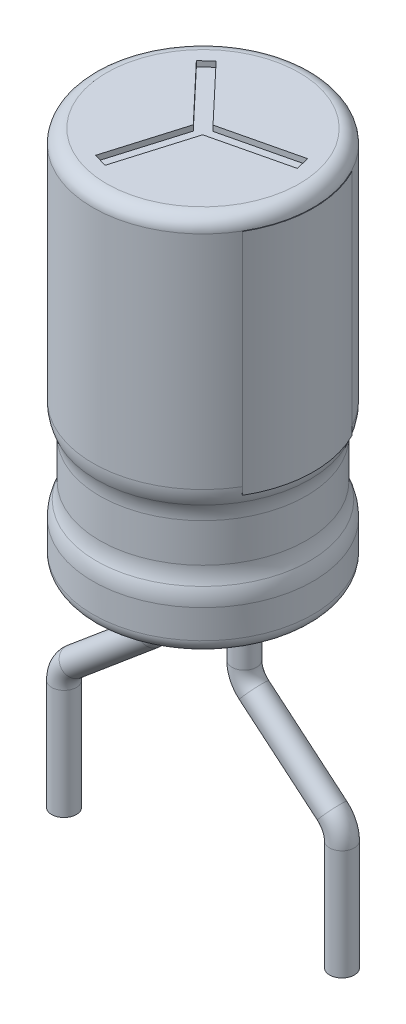
ISO-10303-21;
HEADER;
FILE_DESCRIPTION(('STEP AP214'),'2;1');
FILE_NAME('part.step','',(''),(''),'','','');
FILE_SCHEMA(('AUTOMOTIVE_DESIGN { 1 0 10303 214 1 1 1 1 }'));
ENDSEC;
DATA;
#1=APPLICATION_CONTEXT('core data for automotive mechanical design processes');
#2=APPLICATION_PROTOCOL_DEFINITION('international standard','automotive_design',2000,#1);
#3=PRODUCT_CONTEXT('',#1,'mechanical');
#4=PRODUCT('Part','Part','',(#3));
#5=PRODUCT_RELATED_PRODUCT_CATEGORY('part','',(#4));
#6=PRODUCT_DEFINITION_FORMATION('','',#4);
#7=PRODUCT_DEFINITION_CONTEXT('part definition',#1,'design');
#8=PRODUCT_DEFINITION('design','',#6,#7);
#9=PRODUCT_DEFINITION_SHAPE('','',#8);
#10=(LENGTH_UNIT() NAMED_UNIT(*) SI_UNIT(.MILLI.,.METRE.));
#11=(NAMED_UNIT(*) PLANE_ANGLE_UNIT() SI_UNIT($,.RADIAN.));
#12=(NAMED_UNIT(*) SI_UNIT($,.STERADIAN.) SOLID_ANGLE_UNIT());
#13=UNCERTAINTY_MEASURE_WITH_UNIT(LENGTH_MEASURE(1.E-05),#10,'distance_accuracy_value','');
#14=(GEOMETRIC_REPRESENTATION_CONTEXT(3) GLOBAL_UNCERTAINTY_ASSIGNED_CONTEXT((#13)) GLOBAL_UNIT_ASSIGNED_CONTEXT((#10,
#11,#12)) REPRESENTATION_CONTEXT('',''));
#15=CARTESIAN_POINT('',(0.,0.,0.));
#16=DIRECTION('',(0.,0.,1.));
#17=DIRECTION('',(1.,0.,0.));
#18=AXIS2_PLACEMENT_3D('',#15,#16,#17);
#19=CARTESIAN_POINT('',(0.,7.,0.));
#20=DIRECTION('',(0.,-1.,0.));
#21=DIRECTION('',(0.,0.,-1.));
#22=AXIS2_PLACEMENT_3D('',#19,#20,#21);
#23=CYLINDRICAL_SURFACE('',#22,2.);
#24=DIRECTION('',(0.,-1.,0.));
#25=VECTOR('',#24,1.);
#26=CARTESIAN_POINT('',(1.77843006329833,7.,-0.914978966947711));
#27=LINE('',#26,#25);
#28=CARTESIAN_POINT('',(1.77843006329833,2.62903368974424,-0.91497896694771));
#29=VERTEX_POINT('',#28);
#30=CARTESIAN_POINT('',(1.77843006329833,6.65,-0.91497896694771));
#31=VERTEX_POINT('',#30);
#32=EDGE_CURVE('E148',#29,#31,#27,.F.);
#33=ORIENTED_EDGE('',*,*,#32,.F.);
#34=CARTESIAN_POINT('',(0.,2.62903368974424,0.));
#35=DIRECTION('',(0.,-1.,0.));
#36=DIRECTION('',(0.,0.,-1.));
#37=AXIS2_PLACEMENT_3D('',#34,#35,#36);
#38=CIRCLE('',#37,2.);
#39=CARTESIAN_POINT('',(1.72612375336444,2.62903368974424,1.01019641064055));
#40=VERTEX_POINT('',#39);
#41=EDGE_CURVE('E251',#29,#40,#38,.F.);
#42=ORIENTED_EDGE('',*,*,#41,.T.);
#43=DIRECTION('',(0.,-1.,0.));
#44=VECTOR('',#43,1.);
#45=CARTESIAN_POINT('',(1.72612375336444,7.,1.01019641064056));
#46=LINE('',#45,#44);
#47=CARTESIAN_POINT('',(1.72612375336444,6.65,1.01019641064056));
#48=VERTEX_POINT('',#47);
#49=EDGE_CURVE('E163',#48,#40,#46,.T.);
#50=ORIENTED_EDGE('',*,*,#49,.F.);
#51=CARTESIAN_POINT('',(0.,6.65,0.));
#52=DIRECTION('',(0.,1.,0.));
#53=DIRECTION('',(0.,0.,1.));
#54=AXIS2_PLACEMENT_3D('',#51,#52,#53);
#55=CIRCLE('',#54,2.);
#56=EDGE_CURVE('E232',#48,#31,#55,.F.);
#57=ORIENTED_EDGE('',*,*,#56,.T.);
#58=EDGE_LOOP('',(#33,#42,#50,#57));
#59=FACE_BOUND('',#58,.T.);
#60=ADVANCED_FACE('F37',(#59),#23,.T.);
#61=CARTESIAN_POINT('',(0.,2.62903368974424,0.));
#62=DIRECTION('',(0.,-1.,0.));
#63=DIRECTION('',(0.,0.,-1.));
#64=AXIS2_PLACEMENT_3D('',#61,#62,#63);
#65=TOROIDAL_SURFACE('',#64,1.3,0.7);
#66=CARTESIAN_POINT('',(0.,2.33990785208873,0.));
#67=DIRECTION('',(0.,-1.,0.));
#68=DIRECTION('',(0.,0.,-1.));
#69=AXIS2_PLACEMENT_3D('',#66,#67,#68);
#70=CIRCLE('',#69,1.9375);
#71=CARTESIAN_POINT('',(0.,2.33990785208873,-1.9375));
#72=VERTEX_POINT('',#71);
#73=EDGE_CURVE('E254',#72,#72,#70,.T.);
#74=ORIENTED_EDGE('',*,*,#73,.F.);
#75=EDGE_LOOP('',(#74));
#76=FACE_BOUND('',#75,.T.);
#77=ORIENTED_EDGE('',*,*,#41,.F.);
#78=CARTESIAN_POINT('',(1.15597954114391,2.62903368974424,-0.594736328516011));
#79=DIRECTION('',(0.457489483473855,0.,0.889215031649165));
#80=DIRECTION('',(0.889215031649165,0.,-0.457489483473855));
#81=AXIS2_PLACEMENT_3D('',#78,#79,#80);
#82=CIRCLE('',#81,0.7);
#83=CARTESIAN_POINT('',(1.76776355863175,2.5,-0.90949119004707));
#84=VERTEX_POINT('',#83);
#85=EDGE_CURVE('E12',#29,#84,#82,.F.);
#86=ORIENTED_EDGE('',*,*,#85,.T.);
#87=CARTESIAN_POINT('',(0.,2.5,0.));
#88=DIRECTION('',(0.,1.,0.));
#89=DIRECTION('',(0.,0.,1.));
#90=AXIS2_PLACEMENT_3D('',#87,#88,#89);
#91=CIRCLE('',#90,1.98800458349562);
#92=CARTESIAN_POINT('',(1.71577096668458,2.5,1.00413754729213));
#93=VERTEX_POINT('',#92);
#94=EDGE_CURVE('E271',#84,#93,#91,.F.);
#95=ORIENTED_EDGE('',*,*,#94,.T.);
#96=CARTESIAN_POINT('',(1.12198043968689,2.62903368974424,0.656627666916359));
#97=DIRECTION('',(0.505098205320276,0.,-0.86306187668222));
#98=DIRECTION('',(-0.86306187668222,0.,-0.505098205320276));
#99=AXIS2_PLACEMENT_3D('',#96,#97,#98);
#100=CIRCLE('',#99,0.7);
#101=EDGE_CURVE('E45',#93,#40,#100,.F.);
#102=ORIENTED_EDGE('',*,*,#101,.T.);
#103=EDGE_LOOP('',(#77,#86,#95,#102));
#104=FACE_BOUND('',#103,.T.);
#105=ADVANCED_FACE('F276',(#76,#104),#65,.T.);
#106=CARTESIAN_POINT('',(0.,0.,0.));
#107=DIRECTION('',(0.,1.,0.));
#108=DIRECTION('',(0.,0.,1.));
#109=AXIS2_PLACEMENT_3D('',#106,#107,#108);
#110=PLANE('',#109);
#111=CARTESIAN_POINT('',(0.,0.,0.));
#112=DIRECTION('',(0.,1.,0.));
#113=DIRECTION('',(0.,0.,1.));
#114=AXIS2_PLACEMENT_3D('',#111,#112,#113);
#115=CIRCLE('',#114,1.75);
#116=CARTESIAN_POINT('',(0.,0.,1.75));
#117=VERTEX_POINT('',#116);
#118=EDGE_CURVE('E239',#117,#117,#115,.F.);
#119=ORIENTED_EDGE('',*,*,#118,.T.);
#120=EDGE_LOOP('',(#119));
#121=FACE_BOUND('',#120,.T.);
#122=CARTESIAN_POINT('',(-0.75,0.,0.));
#123=DIRECTION('',(0.,1.,0.));
#124=DIRECTION('',(0.,0.,1.));
#125=AXIS2_PLACEMENT_3D('',#122,#123,#124);
#126=CIRCLE('',#125,0.225);
#127=CARTESIAN_POINT('',(-0.75,0.,0.225));
#128=VERTEX_POINT('',#127);
#129=EDGE_CURVE('E265',#128,#128,#126,.F.);
#130=ORIENTED_EDGE('',*,*,#129,.F.);
#131=EDGE_LOOP('',(#130));
#132=FACE_BOUND('',#131,.T.);
#133=CARTESIAN_POINT('',(0.75,0.,0.));
#134=DIRECTION('',(0.,1.,0.));
#135=DIRECTION('',(0.,0.,1.));
#136=AXIS2_PLACEMENT_3D('',#133,#134,#135);
#137=CIRCLE('',#136,0.225);
#138=CARTESIAN_POINT('',(0.75,0.,0.225));
#139=VERTEX_POINT('',#138);
#140=EDGE_CURVE('E268',#139,#139,#137,.F.);
#141=ORIENTED_EDGE('',*,*,#140,.F.);
#142=EDGE_LOOP('',(#141));
#143=FACE_BOUND('',#142,.T.);
#144=ADVANCED_FACE('F317',(#121,#132,#143),#110,.F.);
#145=CARTESIAN_POINT('',(0.0294668520958253,6.8,0.123534224519211));
#146=DIRECTION('',(0.232022457447443,0.,0.972710429285124));
#147=DIRECTION('',(0.972710429285124,0.,-0.232022457447443));
#148=AXIS2_PLACEMENT_3D('',#145,#146,#147);
#149=PLANE('',#148);
#150=DIRECTION('',(0.,-1.,0.));
#151=VECTOR('',#150,1.);
#152=CARTESIAN_POINT('',(0.100789369876124,6.8,0.106521529529515));
#153=LINE('',#152,#151);
#154=CARTESIAN_POINT('',(0.100789369876124,6.9,0.106521529529515));
#155=VERTEX_POINT('',#154);
#156=CARTESIAN_POINT('',(0.100789369876124,6.8,0.106521529529515));
#157=VERTEX_POINT('',#156);
#158=EDGE_CURVE('E263',#155,#157,#153,.T.);
#159=ORIENTED_EDGE('',*,*,#158,.F.);
#160=DIRECTION('',(0.972710429285124,0.,-0.232022457447443));
#161=VECTOR('',#160,1.);
#162=CARTESIAN_POINT('',(0.0294668520958253,6.9,0.123534224519211));
#163=LINE('',#162,#161);
#164=CARTESIAN_POINT('',(1.48853249602351,6.9,-0.224499461651954));
#165=VERTEX_POINT('',#164);
#166=EDGE_CURVE('E193',#155,#165,#163,.T.);
#167=ORIENTED_EDGE('',*,*,#166,.T.);
#168=DIRECTION('',(0.,1.,0.));
#169=VECTOR('',#168,1.);
#170=CARTESIAN_POINT('',(1.48853249602351,6.8,-0.224499461651954));
#171=LINE('',#170,#169);
#172=CARTESIAN_POINT('',(1.48853249602351,6.8,-0.224499461651954));
#173=VERTEX_POINT('',#172);
#174=EDGE_CURVE('E202',#173,#165,#171,.T.);
#175=ORIENTED_EDGE('',*,*,#174,.F.);
#176=DIRECTION('',(0.972710429285124,0.,-0.232022457447443));
#177=VECTOR('',#176,1.);
#178=CARTESIAN_POINT('',(0.0294668520958253,6.8,0.123534224519211));
#179=LINE('',#178,#177);
#180=EDGE_CURVE('E194',#157,#173,#179,.T.);
#181=ORIENTED_EDGE('',*,*,#180,.F.);
#182=EDGE_LOOP('',(#159,#167,#175,#181));
#183=FACE_BOUND('',#182,.T.);
#184=ADVANCED_FACE('F437',(#183),#149,.F.);
#185=CARTESIAN_POINT('',(0.,6.9,0.));
#186=DIRECTION('',(0.,1.,0.));
#187=DIRECTION('',(0.,0.,1.));
#188=AXIS2_PLACEMENT_3D('',#185,#186,#187);
#189=PLANE('',#188);
#190=DIRECTION('',(-0.285417872244573,0.,0.958403171010708));
#191=VECTOR('',#190,1.);
#192=CARTESIAN_POINT('',(-0.12171720271836,6.9,-0.0362480697750608));
#193=LINE('',#192,#191);
#194=CARTESIAN_POINT('',(-0.142645035560595,6.9,0.0340253899793922));
#195=VERTEX_POINT('',#194);
#196=CARTESIAN_POINT('',(-0.54984401108522,6.9,1.401356686741));
#197=VERTEX_POINT('',#196);
#198=EDGE_CURVE('E171',#195,#197,#193,.T.);
#199=ORIENTED_EDGE('',*,*,#198,.F.);
#200=DIRECTION('',(-0.687292557040545,0.,-0.726380713563259));
#201=VECTOR('',#200,1.);
#202=CARTESIAN_POINT('',(-0.0922503506225339,6.9,0.0872861547441492));
#203=LINE('',#202,#201);
#204=CARTESIAN_POINT('',(-1.12318918618335,6.9,-1.00228491560074));
#205=VERTEX_POINT('',#204);
#206=EDGE_CURVE('E218',#195,#205,#203,.T.);
#207=ORIENTED_EDGE('',*,*,#206,.T.);
#208=DIRECTION('',(0.72638071356326,0.,-0.687292557040545));
#209=VECTOR('',#208,1.);
#210=CARTESIAN_POINT('',(-1.12318918618335,6.9,-1.00228491560074));
#211=LINE('',#210,#209);
#212=CARTESIAN_POINT('',(-0.938688484938284,6.9,-1.17685722508904));
#213=VERTEX_POINT('',#212);
#214=EDGE_CURVE('E225',#205,#213,#211,.T.);
#215=ORIENTED_EDGE('',*,*,#214,.T.);
#216=DIRECTION('',(-0.687292557040545,0.,-0.726380713563259));
#217=VECTOR('',#216,1.);
#218=CARTESIAN_POINT('',(0.0922503506225339,6.9,-0.0872861547441492));
#219=LINE('',#218,#217);
#220=CARTESIAN_POINT('',(0.0418556656844723,6.9,-0.140546919508906));
#221=VERTEX_POINT('',#220);
#222=EDGE_CURVE('E60',#221,#213,#219,.T.);
#223=ORIENTED_EDGE('',*,*,#222,.F.);
#224=DIRECTION('',(0.972710429285124,0.,-0.232022457447443));
#225=VECTOR('',#224,1.);
#226=CARTESIAN_POINT('',(-0.0294668520958253,6.9,-0.123534224519211));
#227=LINE('',#226,#225);
#228=CARTESIAN_POINT('',(1.42959879183186,6.9,-0.471567910690376));
#229=VERTEX_POINT('',#228);
#230=EDGE_CURVE('E197',#221,#229,#227,.T.);
#231=ORIENTED_EDGE('',*,*,#230,.T.);
#232=DIRECTION('',(0.232022457447443,0.,0.972710429285124));
#233=VECTOR('',#232,1.);
#234=CARTESIAN_POINT('',(1.42959879183186,6.9,-0.471567910690376));
#235=LINE('',#234,#233);
#236=EDGE_CURVE('E204',#229,#165,#235,.T.);
#237=ORIENTED_EDGE('',*,*,#236,.T.);
#238=ORIENTED_EDGE('',*,*,#166,.F.);
#239=DIRECTION('',(-0.285417872244573,0.,0.958403171010708));
#240=VECTOR('',#239,1.);
#241=CARTESIAN_POINT('',(0.12171720271836,6.9,0.0362480697750608));
#242=LINE('',#241,#240);
#243=CARTESIAN_POINT('',(-0.3064096056485,6.9,1.47385282629112));
#244=VERTEX_POINT('',#243);
#245=EDGE_CURVE('E175',#155,#244,#242,.T.);
#246=ORIENTED_EDGE('',*,*,#245,.T.);
#247=DIRECTION('',(-0.958403171010708,0.,-0.285417872244573));
#248=VECTOR('',#247,1.);
#249=CARTESIAN_POINT('',(-0.3064096056485,6.9,1.47385282629112));
#250=LINE('',#249,#248);
#251=EDGE_CURVE('E182',#244,#197,#250,.T.);
#252=ORIENTED_EDGE('',*,*,#251,.T.);
#253=EDGE_LOOP('',(#199,#207,#215,#223,#231,#237,#238,#246,#252));
#254=FACE_BOUND('',#253,.T.);
#255=CARTESIAN_POINT('',(0.,6.9,0.));
#256=DIRECTION('',(0.,1.,0.));
#257=DIRECTION('',(0.,0.,1.));
#258=AXIS2_PLACEMENT_3D('',#255,#256,#257);
#259=CIRCLE('',#258,1.75);
#260=CARTESIAN_POINT('',(0.,6.9,1.75));
#261=VERTEX_POINT('',#260);
#262=EDGE_CURVE('E242',#261,#261,#259,.T.);
#263=ORIENTED_EDGE('',*,*,#262,.T.);
#264=EDGE_LOOP('',(#263));
#265=FACE_BOUND('',#264,.T.);
#266=ADVANCED_FACE('F331',(#254,#265),#189,.T.);
#267=CARTESIAN_POINT('',(0.0922503506225339,6.8,-0.0872861547441492));
#268=DIRECTION('',(0.726380713563259,0.,-0.687292557040545));
#269=DIRECTION('',(-0.687292557040545,0.,-0.726380713563259));
#270=AXIS2_PLACEMENT_3D('',#267,#268,#269);
#271=PLANE('',#270);
#272=DIRECTION('',(0.,-1.,0.));
#273=VECTOR('',#272,1.);
#274=CARTESIAN_POINT('',(0.0418556656844723,6.8,-0.140546919508906));
#275=LINE('',#274,#273);
#276=CARTESIAN_POINT('',(0.0418556656844723,6.8,-0.140546919508906));
#277=VERTEX_POINT('',#276);
#278=EDGE_CURVE('E211',#221,#277,#275,.T.);
#279=ORIENTED_EDGE('',*,*,#278,.F.);
#280=ORIENTED_EDGE('',*,*,#222,.T.);
#281=DIRECTION('',(0.,1.,0.));
#282=VECTOR('',#281,1.);
#283=CARTESIAN_POINT('',(-0.938688484938284,6.8,-1.17685722508904));
#284=LINE('',#283,#282);
#285=CARTESIAN_POINT('',(-0.938688484938284,6.8,-1.17685722508904));
#286=VERTEX_POINT('',#285);
#287=EDGE_CURVE('E223',#286,#213,#284,.T.);
#288=ORIENTED_EDGE('',*,*,#287,.F.);
#289=DIRECTION('',(-0.687292557040545,0.,-0.726380713563259));
#290=VECTOR('',#289,1.);
#291=CARTESIAN_POINT('',(0.0922503506225339,6.8,-0.0872861547441492));
#292=LINE('',#291,#290);
#293=EDGE_CURVE('E215',#277,#286,#292,.T.);
#294=ORIENTED_EDGE('',*,*,#293,.F.);
#295=EDGE_LOOP('',(#279,#280,#288,#294));
#296=FACE_BOUND('',#295,.T.);
#297=ADVANCED_FACE('F323',(#296),#271,.F.);
#298=CARTESIAN_POINT('',(0.,0.770966310255765,0.));
#299=DIRECTION('',(0.,-1.,0.));
#300=DIRECTION('',(0.,0.,-1.));
#301=AXIS2_PLACEMENT_3D('',#298,#299,#300);
#302=CIRCLE('',#301,2.);
#303=CARTESIAN_POINT('',(0.,0.770966310255765,-2.));
#304=VERTEX_POINT('',#303);
#305=EDGE_CURVE('E260',#304,#304,#302,.T.);
#306=ORIENTED_EDGE('',*,*,#305,.T.);
#307=EDGE_LOOP('',(#306));
#308=FACE_BOUND('',#307,.T.);
#309=CARTESIAN_POINT('',(0.,0.25,0.));
#310=DIRECTION('',(0.,1.,0.));
#311=DIRECTION('',(0.,0.,1.));
#312=AXIS2_PLACEMENT_3D('',#309,#310,#311);
#313=CIRCLE('',#312,2.);
#314=CARTESIAN_POINT('',(0.,0.25,2.));
#315=VERTEX_POINT('',#314);
#316=EDGE_CURVE('E236',#315,#315,#313,.T.);
#317=ORIENTED_EDGE('',*,*,#316,.T.);
#318=EDGE_LOOP('',(#317));
#319=FACE_BOUND('',#318,.T.);
#320=ADVANCED_FACE('F313',(#308,#319),#23,.T.);
#321=CARTESIAN_POINT('',(0.,0.25,0.));
#322=DIRECTION('',(0.,1.,0.));
#323=DIRECTION('',(0.,0.,1.));
#324=AXIS2_PLACEMENT_3D('',#321,#322,#323);
#325=TOROIDAL_SURFACE('',#324,1.75,0.25);
#326=ORIENTED_EDGE('',*,*,#118,.F.);
#327=EDGE_LOOP('',(#326));
#328=FACE_BOUND('',#327,.T.);
#329=ORIENTED_EDGE('',*,*,#316,.F.);
#330=EDGE_LOOP('',(#329));
#331=FACE_BOUND('',#330,.T.);
#332=ADVANCED_FACE('F322',(#328,#331),#325,.T.);
#333=CARTESIAN_POINT('',(0.,0.95,0.));
#334=DIRECTION('',(0.,1.,0.));
#335=DIRECTION('',(0.,0.,1.));
#336=AXIS2_PLACEMENT_3D('',#333,#334,#335);
#337=CYLINDRICAL_SURFACE('',#336,1.875);
#338=CARTESIAN_POINT('',(0.,1.34921798556678,0.));
#339=DIRECTION('',(0.,-1.,0.));
#340=DIRECTION('',(0.,0.,-1.));
#341=AXIS2_PLACEMENT_3D('',#338,#339,#340);
#342=CIRCLE('',#341,1.875);
#343=CARTESIAN_POINT('',(0.,1.34921798556678,-1.875));
#344=VERTEX_POINT('',#343);
#345=EDGE_CURVE('E248',#344,#344,#342,.F.);
#346=ORIENTED_EDGE('',*,*,#345,.T.);
#347=EDGE_LOOP('',(#346));
#348=FACE_BOUND('',#347,.T.);
#349=CARTESIAN_POINT('',(0.,2.05078201443322,0.));
#350=DIRECTION('',(0.,1.,0.));
#351=DIRECTION('',(0.,0.,1.));
#352=AXIS2_PLACEMENT_3D('',#349,#350,#351);
#353=CIRCLE('',#352,1.875);
#354=CARTESIAN_POINT('',(0.,2.05078201443322,1.875));
#355=VERTEX_POINT('',#354);
#356=EDGE_CURVE('E245',#355,#355,#353,.F.);
#357=ORIENTED_EDGE('',*,*,#356,.T.);
#358=EDGE_LOOP('',(#357));
#359=FACE_BOUND('',#358,.T.);
#360=ADVANCED_FACE('F329',(#348,#359),#337,.T.);
#361=CARTESIAN_POINT('',(0.,6.65,0.));
#362=DIRECTION('',(0.,1.,0.));
#363=DIRECTION('',(0.,0.,1.));
#364=AXIS2_PLACEMENT_3D('',#361,#362,#363);
#365=TOROIDAL_SURFACE('',#364,1.75,0.25);
#366=EDGE_CURVE('E234',#31,#48,#55,.F.);
#367=ORIENTED_EDGE('',*,*,#366,.F.);
#368=ORIENTED_EDGE('',*,*,#56,.F.);
#369=EDGE_LOOP('',(#367,#368));
#370=FACE_BOUND('',#369,.T.);
#371=ORIENTED_EDGE('',*,*,#262,.F.);
#372=EDGE_LOOP('',(#371));
#373=FACE_BOUND('',#372,.T.);
#374=ADVANCED_FACE('F283',(#370,#373),#365,.T.);
#375=CARTESIAN_POINT('',(0.,1.34921798556678,0.));
#376=DIRECTION('',(0.,-1.,0.));
#377=DIRECTION('',(0.,0.,-1.));
#378=AXIS2_PLACEMENT_3D('',#375,#376,#377);
#379=TOROIDAL_SURFACE('',#378,2.575,0.7);
#380=CARTESIAN_POINT('',(0.,1.06009214791127,0.));
#381=DIRECTION('',(0.,1.,0.));
#382=DIRECTION('',(0.,0.,1.));
#383=AXIS2_PLACEMENT_3D('',#380,#381,#382);
#384=CIRCLE('',#383,1.9375);
#385=CARTESIAN_POINT('',(0.,1.06009214791127,1.9375));
#386=VERTEX_POINT('',#385);
#387=EDGE_CURVE('E257',#386,#386,#384,.T.);
#388=ORIENTED_EDGE('',*,*,#387,.T.);
#389=EDGE_LOOP('',(#388));
#390=FACE_BOUND('',#389,.T.);
#391=ORIENTED_EDGE('',*,*,#345,.F.);
#392=EDGE_LOOP('',(#391));
#393=FACE_BOUND('',#392,.T.);
#394=ADVANCED_FACE('F344',(#390,#393),#379,.F.);
#395=CARTESIAN_POINT('',(0.,2.05078201443322,0.));
#396=DIRECTION('',(0.,1.,0.));
#397=DIRECTION('',(0.,0.,1.));
#398=AXIS2_PLACEMENT_3D('',#395,#396,#397);
#399=TOROIDAL_SURFACE('',#398,2.575,0.7);
#400=ORIENTED_EDGE('',*,*,#73,.T.);
#401=EDGE_LOOP('',(#400));
#402=FACE_BOUND('',#401,.T.);
#403=ORIENTED_EDGE('',*,*,#356,.F.);
#404=EDGE_LOOP('',(#403));
#405=FACE_BOUND('',#404,.T.);
#406=ADVANCED_FACE('F341',(#402,#405),#399,.F.);
#407=CARTESIAN_POINT('',(0.,0.770966310255765,0.));
#408=DIRECTION('',(0.,-1.,0.));
#409=DIRECTION('',(0.,0.,-1.));
#410=AXIS2_PLACEMENT_3D('',#407,#408,#409);
#411=TOROIDAL_SURFACE('',#410,1.3,0.7);
#412=ORIENTED_EDGE('',*,*,#305,.F.);
#413=EDGE_LOOP('',(#412));
#414=FACE_BOUND('',#413,.T.);
#415=ORIENTED_EDGE('',*,*,#387,.F.);
#416=EDGE_LOOP('',(#415));
#417=FACE_BOUND('',#416,.T.);
#418=ADVANCED_FACE('F39',(#414,#417),#411,.T.);
#419=CARTESIAN_POINT('',(-0.0922503506225339,6.8,0.0872861547441492));
#420=DIRECTION('',(0.726380713563259,0.,-0.687292557040545));
#421=DIRECTION('',(-0.687292557040545,0.,-0.726380713563259));
#422=AXIS2_PLACEMENT_3D('',#419,#420,#421);
#423=PLANE('',#422);
#424=DIRECTION('',(0.,1.,0.));
#425=VECTOR('',#424,1.);
#426=CARTESIAN_POINT('',(-0.142645035560595,6.8,0.0340253899793922));
#427=LINE('',#426,#425);
#428=CARTESIAN_POINT('',(-0.142645035560596,6.8,0.0340253899793922));
#429=VERTEX_POINT('',#428);
#430=EDGE_CURVE('E189',#429,#195,#427,.T.);
#431=ORIENTED_EDGE('',*,*,#430,.F.);
#432=DIRECTION('',(-0.687292557040545,0.,-0.726380713563259));
#433=VECTOR('',#432,1.);
#434=CARTESIAN_POINT('',(-0.0922503506225339,6.8,0.0872861547441492));
#435=LINE('',#434,#433);
#436=CARTESIAN_POINT('',(-1.12318918618335,6.8,-1.00228491560074));
#437=VERTEX_POINT('',#436);
#438=EDGE_CURVE('E221',#429,#437,#435,.T.);
#439=ORIENTED_EDGE('',*,*,#438,.T.);
#440=DIRECTION('',(0.,1.,0.));
#441=VECTOR('',#440,1.);
#442=CARTESIAN_POINT('',(-1.12318918618335,6.8,-1.00228491560074));
#443=LINE('',#442,#441);
#444=EDGE_CURVE('E229',#437,#205,#443,.T.);
#445=ORIENTED_EDGE('',*,*,#444,.T.);
#446=ORIENTED_EDGE('',*,*,#206,.F.);
#447=EDGE_LOOP('',(#431,#439,#445,#446));
#448=FACE_BOUND('',#447,.T.);
#449=ADVANCED_FACE('F340',(#448),#423,.T.);
#450=CARTESIAN_POINT('',(-1.12318918618335,6.8,-1.00228491560074));
#451=DIRECTION('',(0.687292557040544,0.,0.726380713563259));
#452=DIRECTION('',(0.726380713563259,0.,-0.687292557040544));
#453=AXIS2_PLACEMENT_3D('',#450,#451,#452);
#454=PLANE('',#453);
#455=ORIENTED_EDGE('',*,*,#214,.F.);
#456=ORIENTED_EDGE('',*,*,#444,.F.);
#457=DIRECTION('',(0.72638071356326,0.,-0.687292557040545));
#458=VECTOR('',#457,1.);
#459=CARTESIAN_POINT('',(-1.12318918618335,6.8,-1.00228491560074));
#460=LINE('',#459,#458);
#461=EDGE_CURVE('E217',#437,#286,#460,.T.);
#462=ORIENTED_EDGE('',*,*,#461,.T.);
#463=ORIENTED_EDGE('',*,*,#287,.T.);
#464=EDGE_LOOP('',(#455,#456,#462,#463));
#465=FACE_BOUND('',#464,.T.);
#466=ADVANCED_FACE('F392',(#465),#454,.T.);
#467=CARTESIAN_POINT('',(0.0922503506225339,6.8,-0.0872861547441492));
#468=DIRECTION('',(0.,1.,0.));
#469=DIRECTION('',(-1.,0.,0.));
#470=AXIS2_PLACEMENT_3D('',#467,#468,#469);
#471=PLANE('',#470);
#472=ORIENTED_EDGE('',*,*,#438,.F.);
#473=DIRECTION('',(-0.285417872244573,0.,0.958403171010708));
#474=VECTOR('',#473,1.);
#475=CARTESIAN_POINT('',(-0.12171720271836,6.8,-0.0362480697750608));
#476=LINE('',#475,#474);
#477=CARTESIAN_POINT('',(-0.54984401108522,6.8,1.401356686741));
#478=VERTEX_POINT('',#477);
#479=EDGE_CURVE('E172',#429,#478,#476,.T.);
#480=ORIENTED_EDGE('',*,*,#479,.T.);
#481=DIRECTION('',(-0.958403171010708,0.,-0.285417872244573));
#482=VECTOR('',#481,1.);
#483=CARTESIAN_POINT('',(-0.3064096056485,6.8,1.47385282629112));
#484=LINE('',#483,#482);
#485=CARTESIAN_POINT('',(-0.3064096056485,6.8,1.47385282629112));
#486=VERTEX_POINT('',#485);
#487=EDGE_CURVE('E174',#486,#478,#484,.T.);
#488=ORIENTED_EDGE('',*,*,#487,.F.);
#489=DIRECTION('',(-0.285417872244573,0.,0.958403171010708));
#490=VECTOR('',#489,1.);
#491=CARTESIAN_POINT('',(0.12171720271836,6.8,0.0362480697750608));
#492=LINE('',#491,#490);
#493=EDGE_CURVE('E178',#157,#486,#492,.T.);
#494=ORIENTED_EDGE('',*,*,#493,.F.);
#495=ORIENTED_EDGE('',*,*,#180,.T.);
#496=DIRECTION('',(0.232022457447443,0.,0.972710429285124));
#497=VECTOR('',#496,1.);
#498=CARTESIAN_POINT('',(1.42959879183186,6.8,-0.471567910690376));
#499=LINE('',#498,#497);
#500=CARTESIAN_POINT('',(1.42959879183186,6.8,-0.471567910690376));
#501=VERTEX_POINT('',#500);
#502=EDGE_CURVE('E196',#501,#173,#499,.T.);
#503=ORIENTED_EDGE('',*,*,#502,.F.);
#504=DIRECTION('',(0.972710429285124,0.,-0.232022457447443));
#505=VECTOR('',#504,1.);
#506=CARTESIAN_POINT('',(-0.0294668520958253,6.8,-0.123534224519211));
#507=LINE('',#506,#505);
#508=EDGE_CURVE('E200',#277,#501,#507,.T.);
#509=ORIENTED_EDGE('',*,*,#508,.F.);
#510=ORIENTED_EDGE('',*,*,#293,.T.);
#511=ORIENTED_EDGE('',*,*,#461,.F.);
#512=EDGE_LOOP('',(#472,#480,#488,#494,#495,#503,#509,#510,#511));
#513=FACE_BOUND('',#512,.T.);
#514=ADVANCED_FACE('F397',(#513),#471,.T.);
#515=CARTESIAN_POINT('',(-0.0294668520958253,6.8,-0.123534224519211));
#516=DIRECTION('',(0.232022457447443,0.,0.972710429285124));
#517=DIRECTION('',(0.972710429285124,0.,-0.232022457447443));
#518=AXIS2_PLACEMENT_3D('',#515,#516,#517);
#519=PLANE('',#518);
#520=ORIENTED_EDGE('',*,*,#278,.T.);
#521=ORIENTED_EDGE('',*,*,#508,.T.);
#522=DIRECTION('',(0.,1.,0.));
#523=VECTOR('',#522,1.);
#524=CARTESIAN_POINT('',(1.42959879183186,6.8,-0.471567910690376));
#525=LINE('',#524,#523);
#526=EDGE_CURVE('E209',#501,#229,#525,.T.);
#527=ORIENTED_EDGE('',*,*,#526,.T.);
#528=ORIENTED_EDGE('',*,*,#230,.F.);
#529=EDGE_LOOP('',(#520,#521,#527,#528));
#530=FACE_BOUND('',#529,.T.);
#531=ADVANCED_FACE('F413',(#530),#519,.T.);
#532=CARTESIAN_POINT('',(1.42959879183186,6.8,-0.471567910690376));
#533=DIRECTION('',(-0.972710429285124,0.,0.232022457447443));
#534=DIRECTION('',(0.232022457447443,0.,0.972710429285124));
#535=AXIS2_PLACEMENT_3D('',#532,#533,#534);
#536=PLANE('',#535);
#537=ORIENTED_EDGE('',*,*,#236,.F.);
#538=ORIENTED_EDGE('',*,*,#526,.F.);
#539=ORIENTED_EDGE('',*,*,#502,.T.);
#540=ORIENTED_EDGE('',*,*,#174,.T.);
#541=EDGE_LOOP('',(#537,#538,#539,#540));
#542=FACE_BOUND('',#541,.T.);
#543=ADVANCED_FACE('F418',(#542),#536,.T.);
#544=CARTESIAN_POINT('',(0.12171720271836,6.8,0.0362480697750608));
#545=DIRECTION('',(-0.958403171010708,0.,-0.285417872244573));
#546=DIRECTION('',(-0.285417872244573,0.,0.958403171010708));
#547=AXIS2_PLACEMENT_3D('',#544,#545,#546);
#548=PLANE('',#547);
#549=ORIENTED_EDGE('',*,*,#158,.T.);
#550=ORIENTED_EDGE('',*,*,#493,.T.);
#551=DIRECTION('',(0.,1.,0.));
#552=VECTOR('',#551,1.);
#553=CARTESIAN_POINT('',(-0.3064096056485,6.8,1.47385282629112));
#554=LINE('',#553,#552);
#555=EDGE_CURVE('E187',#486,#244,#554,.T.);
#556=ORIENTED_EDGE('',*,*,#555,.T.);
#557=ORIENTED_EDGE('',*,*,#245,.F.);
#558=EDGE_LOOP('',(#549,#550,#556,#557));
#559=FACE_BOUND('',#558,.T.);
#560=ADVANCED_FACE('F429',(#559),#548,.T.);
#561=CARTESIAN_POINT('',(-0.12171720271836,6.8,-0.0362480697750608));
#562=DIRECTION('',(-0.958403171010708,0.,-0.285417872244573));
#563=DIRECTION('',(-0.285417872244573,0.,0.958403171010708));
#564=AXIS2_PLACEMENT_3D('',#561,#562,#563);
#565=PLANE('',#564);
#566=ORIENTED_EDGE('',*,*,#430,.T.);
#567=ORIENTED_EDGE('',*,*,#198,.T.);
#568=DIRECTION('',(0.,1.,0.));
#569=VECTOR('',#568,1.);
#570=CARTESIAN_POINT('',(-0.54984401108522,6.8,1.401356686741));
#571=LINE('',#570,#569);
#572=EDGE_CURVE('E180',#478,#197,#571,.T.);
#573=ORIENTED_EDGE('',*,*,#572,.F.);
#574=ORIENTED_EDGE('',*,*,#479,.F.);
#575=EDGE_LOOP('',(#566,#567,#573,#574));
#576=FACE_BOUND('',#575,.T.);
#577=ADVANCED_FACE('F472',(#576),#565,.F.);
#578=CARTESIAN_POINT('',(-0.3064096056485,6.8,1.47385282629112));
#579=DIRECTION('',(0.285417872244573,0.,-0.958403171010708));
#580=DIRECTION('',(-0.958403171010708,0.,-0.285417872244573));
#581=AXIS2_PLACEMENT_3D('',#578,#579,#580);
#582=PLANE('',#581);
#583=ORIENTED_EDGE('',*,*,#251,.F.);
#584=ORIENTED_EDGE('',*,*,#555,.F.);
#585=ORIENTED_EDGE('',*,*,#487,.T.);
#586=ORIENTED_EDGE('',*,*,#572,.T.);
#587=EDGE_LOOP('',(#583,#584,#585,#586));
#588=FACE_BOUND('',#587,.T.);
#589=ADVANCED_FACE('F482',(#588),#582,.T.);
#590=CARTESIAN_POINT('',(-0.75,-0.77,0.));
#591=DIRECTION('',(0.,1.,0.));
#592=DIRECTION('',(0.,0.,1.));
#593=AXIS2_PLACEMENT_3D('',#590,#591,#592);
#594=CYLINDRICAL_SURFACE('',#593,0.225);
#595=ORIENTED_EDGE('',*,*,#129,.T.);
#596=EDGE_LOOP('',(#595));
#597=FACE_BOUND('',#596,.T.);
#598=CARTESIAN_POINT('',(-0.75,-1.09273368096696,0.));
#599=DIRECTION('',(0.,-1.,0.));
#600=DIRECTION('',(0.,0.,1.));
#601=AXIS2_PLACEMENT_3D('',#598,#599,#600);
#602=CIRCLE('',#601,0.225);
#603=CARTESIAN_POINT('',(-0.525000000000003,-1.09273368096696,0.));
#604=VERTEX_POINT('',#603);
#605=EDGE_CURVE('E695',#604,#604,#602,.F.);
#606=ORIENTED_EDGE('',*,*,#605,.T.);
#607=EDGE_LOOP('',(#606));
#608=FACE_BOUND('',#607,.T.);
#609=ADVANCED_FACE('F492',(#597,#608),#594,.T.);
#610=CARTESIAN_POINT('',(0.75,-0.77,0.));
#611=DIRECTION('',(0.,1.,0.));
#612=DIRECTION('',(0.,0.,1.));
#613=AXIS2_PLACEMENT_3D('',#610,#611,#612);
#614=CYLINDRICAL_SURFACE('',#613,0.225);
#615=ORIENTED_EDGE('',*,*,#140,.T.);
#616=EDGE_LOOP('',(#615));
#617=FACE_BOUND('',#616,.T.);
#618=CARTESIAN_POINT('',(0.75,-1.09273368096696,0.));
#619=DIRECTION('',(0.,1.,0.));
#620=DIRECTION('',(0.,0.,1.));
#621=AXIS2_PLACEMENT_3D('',#618,#619,#620);
#622=CIRCLE('',#621,0.225);
#623=CARTESIAN_POINT('',(0.525000000000003,-1.09273368096696,0.));
#624=VERTEX_POINT('',#623);
#625=EDGE_CURVE('E664',#624,#624,#622,.T.);
#626=ORIENTED_EDGE('',*,*,#625,.T.);
#627=EDGE_LOOP('',(#626));
#628=FACE_BOUND('',#627,.T.);
#629=ADVANCED_FACE('F517',(#617,#628),#614,.T.);
#630=CARTESIAN_POINT('',(1.76064576266535,6.65,-0.905829177278233));
#631=DIRECTION('',(0.457489483473855,0.,0.889215031649165));
#632=DIRECTION('',(0.889215031649165,0.,-0.457489483473855));
#633=AXIS2_PLACEMENT_3D('',#630,#631,#632);
#634=PLANE('',#633);
#635=ORIENTED_EDGE('',*,*,#85,.F.);
#636=ORIENTED_EDGE('',*,*,#32,.T.);
#637=DIRECTION('',(-0.889215031649165,0.,0.457489483473855));
#638=VECTOR('',#637,1.);
#639=CARTESIAN_POINT('',(1.76064576266535,6.65,-0.905829177278233));
#640=LINE('',#639,#638);
#641=CARTESIAN_POINT('',(1.78732221361482,6.65,-0.919553861782449));
#642=VERTEX_POINT('',#641);
#643=EDGE_CURVE('E140',#642,#31,#640,.T.);
#644=ORIENTED_EDGE('',*,*,#643,.F.);
#645=DIRECTION('',(0.,-1.,0.));
#646=VECTOR('',#645,1.);
#647=CARTESIAN_POINT('',(1.78732221361482,6.65,-0.919553861782449));
#648=LINE('',#647,#646);
#649=CARTESIAN_POINT('',(1.78732221361482,2.5,-0.919553861782449));
#650=VERTEX_POINT('',#649);
#651=EDGE_CURVE('E145',#642,#650,#648,.T.);
#652=ORIENTED_EDGE('',*,*,#651,.T.);
#653=DIRECTION('',(-0.889215031649165,0.,0.457489483473855));
#654=VECTOR('',#653,1.);
#655=CARTESIAN_POINT('',(1.76064576266535,2.5,-0.905829177278233));
#656=LINE('',#655,#654);
#657=EDGE_CURVE('E289',#650,#84,#656,.T.);
#658=ORIENTED_EDGE('',*,*,#657,.T.);
#659=EDGE_LOOP('',(#635,#636,#644,#652,#658));
#660=FACE_BOUND('',#659,.T.);
#661=ADVANCED_FACE('F142',(#660),#634,.F.);
#662=CARTESIAN_POINT('',(1.70886251583079,6.65,1.00009444653416));
#663=DIRECTION('',(0.505098205320276,0.,-0.86306187668222));
#664=DIRECTION('',(-0.86306187668222,0.,-0.505098205320276));
#665=AXIS2_PLACEMENT_3D('',#662,#663,#664);
#666=PLANE('',#665);
#667=DIRECTION('',(0.86306187668222,0.,0.505098205320276));
#668=VECTOR('',#667,1.);
#669=CARTESIAN_POINT('',(1.70886251583079,6.65,1.00009444653416));
#670=LINE('',#669,#668);
#671=CARTESIAN_POINT('',(1.73475437213126,6.65,1.01524739269376));
#672=VERTEX_POINT('',#671);
#673=EDGE_CURVE('E151',#48,#672,#670,.T.);
#674=ORIENTED_EDGE('',*,*,#673,.F.);
#675=ORIENTED_EDGE('',*,*,#49,.T.);
#676=ORIENTED_EDGE('',*,*,#101,.F.);
#677=DIRECTION('',(0.86306187668222,0.,0.505098205320276));
#678=VECTOR('',#677,1.);
#679=CARTESIAN_POINT('',(1.70886251583079,2.5,1.00009444653416));
#680=LINE('',#679,#678);
#681=CARTESIAN_POINT('',(1.73475437213126,2.5,1.01524739269376));
#682=VERTEX_POINT('',#681);
#683=EDGE_CURVE('E52',#93,#682,#680,.T.);
#684=ORIENTED_EDGE('',*,*,#683,.T.);
#685=DIRECTION('',(0.,-1.,0.));
#686=VECTOR('',#685,1.);
#687=CARTESIAN_POINT('',(1.73475437213126,6.65,1.01524739269376));
#688=LINE('',#687,#686);
#689=EDGE_CURVE('E164',#672,#682,#688,.T.);
#690=ORIENTED_EDGE('',*,*,#689,.F.);
#691=EDGE_LOOP('',(#674,#675,#676,#684,#690));
#692=FACE_BOUND('',#691,.T.);
#693=ADVANCED_FACE('F285',(#692),#666,.F.);
#694=CARTESIAN_POINT('',(0.,6.65,0.));
#695=DIRECTION('',(0.,-1.,0.));
#696=DIRECTION('',(0.,0.,-1.));
#697=AXIS2_PLACEMENT_3D('',#694,#695,#696);
#698=CYLINDRICAL_SURFACE('',#697,2.01);
#699=CARTESIAN_POINT('',(0.,2.5,0.));
#700=DIRECTION('',(0.,1.,0.));
#701=DIRECTION('',(0.,0.,1.));
#702=AXIS2_PLACEMENT_3D('',#699,#700,#701);
#703=CIRCLE('',#702,2.01);
#704=EDGE_CURVE('E162',#682,#650,#703,.T.);
#705=ORIENTED_EDGE('',*,*,#704,.T.);
#706=ORIENTED_EDGE('',*,*,#651,.F.);
#707=CARTESIAN_POINT('',(0.,6.65,0.));
#708=DIRECTION('',(0.,1.,0.));
#709=DIRECTION('',(0.,0.,1.));
#710=AXIS2_PLACEMENT_3D('',#707,#708,#709);
#711=CIRCLE('',#710,2.01);
#712=EDGE_CURVE('E152',#672,#642,#711,.T.);
#713=ORIENTED_EDGE('',*,*,#712,.F.);
#714=ORIENTED_EDGE('',*,*,#689,.T.);
#715=EDGE_LOOP('',(#705,#706,#713,#714));
#716=FACE_BOUND('',#715,.T.);
#717=ADVANCED_FACE('F161',(#716),#698,.T.);
#718=CARTESIAN_POINT('',(0.,6.65,0.));
#719=DIRECTION('',(0.,1.,0.));
#720=DIRECTION('',(0.,0.,1.));
#721=AXIS2_PLACEMENT_3D('',#718,#719,#720);
#722=PLANE('',#721);
#723=ORIENTED_EDGE('',*,*,#366,.T.);
#724=ORIENTED_EDGE('',*,*,#673,.T.);
#725=ORIENTED_EDGE('',*,*,#712,.T.);
#726=ORIENTED_EDGE('',*,*,#643,.T.);
#727=EDGE_LOOP('',(#723,#724,#725,#726));
#728=FACE_BOUND('',#727,.T.);
#729=ADVANCED_FACE('F155',(#728),#722,.T.);
#730=CARTESIAN_POINT('',(0.,2.5,0.));
#731=DIRECTION('',(0.,1.,0.));
#732=DIRECTION('',(0.,0.,1.));
#733=AXIS2_PLACEMENT_3D('',#730,#731,#732);
#734=PLANE('',#733);
#735=ORIENTED_EDGE('',*,*,#94,.F.);
#736=ORIENTED_EDGE('',*,*,#657,.F.);
#737=ORIENTED_EDGE('',*,*,#704,.F.);
#738=ORIENTED_EDGE('',*,*,#683,.F.);
#739=EDGE_LOOP('',(#735,#736,#737,#738));
#740=FACE_BOUND('',#739,.T.);
#741=ADVANCED_FACE('F291',(#740),#734,.F.);
#742=CARTESIAN_POINT('',(2.52439461008355,-5.04793520200605,0.));
#743=DIRECTION('',(0.,1.,0.));
#744=DIRECTION('',(0.,0.,1.));
#745=AXIS2_PLACEMENT_3D('',#742,#743,#744);
#746=PLANE('',#745);
#747=CARTESIAN_POINT('',(2.52439461008355,-5.04793520200605,0.));
#748=DIRECTION('',(0.,1.,0.));
#749=DIRECTION('',(0.,0.,1.));
#750=AXIS2_PLACEMENT_3D('',#747,#748,#749);
#751=CIRCLE('',#750,0.225);
#752=CARTESIAN_POINT('',(2.52439461008355,-5.04793520200605,0.225));
#753=VERTEX_POINT('',#752);
#754=EDGE_CURVE('E290',#753,#753,#751,.T.);
#755=ORIENTED_EDGE('',*,*,#754,.F.);
#756=EDGE_LOOP('',(#755));
#757=FACE_BOUND('',#756,.T.);
#758=ADVANCED_FACE('F293',(#757),#746,.F.);
#759=CARTESIAN_POINT('',(1.25,-1.09273368096697,0.));
#760=DIRECTION('',(0.,0.,1.));
#761=DIRECTION('',(1.,0.,0.));
#762=AXIS2_PLACEMENT_3D('',#759,#760,#761);
#763=TOROIDAL_SURFACE('',#762,0.499999999999997,0.225);
#764=CARTESIAN_POINT('',(0.928606195156725,-1.47575590252645,0.));
#765=DIRECTION('',(-0.76604444311897,0.642787609686549,0.));
#766=DIRECTION('',(0.,0.,1.));
#767=AXIS2_PLACEMENT_3D('',#764,#765,#766);
#768=CIRCLE('',#767,0.225);
#769=CARTESIAN_POINT('',(0.783978982977254,-1.64811590222822,0.));
#770=VERTEX_POINT('',#769);
#771=EDGE_CURVE('E661',#770,#770,#768,.T.);
#772=CARTESIAN_POINT('',(1.25,-1.09273368096697,0.));
#773=DIRECTION('',(0.,0.,1.));
#774=DIRECTION('',(1.,0.,0.));
#775=AXIS2_PLACEMENT_3D('',#772,#773,#774);
#776=CIRCLE('',#775,0.724999999999997);
#777=EDGE_CURVE('',#624,#770,#776,.T.);
#778=ORIENTED_EDGE('',*,*,#625,.F.);
#779=ORIENTED_EDGE('',*,*,#771,.T.);
#780=ORIENTED_EDGE('',*,*,#777,.T.);
#781=ORIENTED_EDGE('',*,*,#777,.F.);
#782=EDGE_LOOP('',(#778,#780,#779,#781));
#783=FACE_BOUND('',#782,.T.);
#784=ADVANCED_FACE('F300',(#783),#763,.T.);
#785=CARTESIAN_POINT('',(0.928606195156725,-1.47575590252645,0.));
#786=DIRECTION('',(0.76604444311897,-0.642787609686549,0.));
#787=DIRECTION('',(0.642787609686549,0.76604444311897,0.));
#788=AXIS2_PLACEMENT_3D('',#785,#786,#787);
#789=CYLINDRICAL_SURFACE('',#788,0.225);
#790=CARTESIAN_POINT('',(2.34578841492682,-2.66491298044657,0.));
#791=DIRECTION('',(-0.76604444311897,0.642787609686549,0.));
#792=DIRECTION('',(0.,0.,1.));
#793=AXIS2_PLACEMENT_3D('',#790,#791,#792);
#794=CIRCLE('',#793,0.225);
#795=CARTESIAN_POINT('',(2.49041562710629,-2.4925529807448,0.));
#796=VERTEX_POINT('',#795);
#797=EDGE_CURVE('E668',#796,#796,#794,.T.);
#798=ORIENTED_EDGE('',*,*,#797,.T.);
#799=EDGE_LOOP('',(#798));
#800=FACE_BOUND('',#799,.T.);
#801=ORIENTED_EDGE('',*,*,#771,.F.);
#802=EDGE_LOOP('',(#801));
#803=FACE_BOUND('',#802,.T.);
#804=ADVANCED_FACE('F597',(#800,#803),#789,.T.);
#805=CARTESIAN_POINT('',(2.02439461008355,-3.04793520200605,0.));
#806=DIRECTION('',(0.,0.,-1.));
#807=DIRECTION('',(-1.,0.,0.));
#808=AXIS2_PLACEMENT_3D('',#805,#806,#807);
#809=TOROIDAL_SURFACE('',#808,0.5,0.225);
#810=CARTESIAN_POINT('',(2.52439461008355,-3.04793520200605,0.));
#811=DIRECTION('',(0.,1.,0.));
#812=DIRECTION('',(0.,0.,1.));
#813=AXIS2_PLACEMENT_3D('',#810,#811,#812);
#814=CIRCLE('',#813,0.225);
#815=CARTESIAN_POINT('',(2.74939461008355,-3.04793520200605,0.));
#816=VERTEX_POINT('',#815);
#817=EDGE_CURVE('E677',#816,#816,#814,.T.);
#818=CARTESIAN_POINT('',(2.02439461008355,-3.04793520200605,0.));
#819=DIRECTION('',(0.,0.,-1.));
#820=DIRECTION('',(-1.,0.,0.));
#821=AXIS2_PLACEMENT_3D('',#818,#819,#820);
#822=CIRCLE('',#821,0.725);
#823=EDGE_CURVE('',#796,#816,#822,.T.);
#824=ORIENTED_EDGE('',*,*,#797,.F.);
#825=ORIENTED_EDGE('',*,*,#817,.T.);
#826=ORIENTED_EDGE('',*,*,#823,.T.);
#827=ORIENTED_EDGE('',*,*,#823,.F.);
#828=EDGE_LOOP('',(#824,#826,#825,#827));
#829=FACE_BOUND('',#828,.T.);
#830=ADVANCED_FACE('F308',(#829),#809,.T.);
#831=CARTESIAN_POINT('',(2.52439461008355,-3.04793520200605,0.));
#832=DIRECTION('',(0.,-1.,0.));
#833=DIRECTION('',(1.,0.,0.));
#834=AXIS2_PLACEMENT_3D('',#831,#832,#833);
#835=CYLINDRICAL_SURFACE('',#834,0.225);
#836=ORIENTED_EDGE('',*,*,#754,.T.);
#837=EDGE_LOOP('',(#836));
#838=FACE_BOUND('',#837,.T.);
#839=ORIENTED_EDGE('',*,*,#817,.F.);
#840=EDGE_LOOP('',(#839));
#841=FACE_BOUND('',#840,.T.);
#842=ADVANCED_FACE('F295',(#838,#841),#835,.T.);
#843=CARTESIAN_POINT('',(-2.52439461008355,-5.04793520200605,0.));
#844=DIRECTION('',(0.,1.,0.));
#845=DIRECTION('',(0.,0.,1.));
#846=AXIS2_PLACEMENT_3D('',#843,#844,#845);
#847=PLANE('',#846);
#848=CARTESIAN_POINT('',(-2.52439461008355,-5.04793520200605,0.));
#849=DIRECTION('',(0.,-1.,0.));
#850=DIRECTION('',(0.,0.,1.));
#851=AXIS2_PLACEMENT_3D('',#848,#849,#850);
#852=CIRCLE('',#851,0.225);
#853=CARTESIAN_POINT('',(-2.52439461008355,-5.04793520200605,0.225));
#854=VERTEX_POINT('',#853);
#855=EDGE_CURVE('E666',#854,#854,#852,.F.);
#856=ORIENTED_EDGE('',*,*,#855,.F.);
#857=EDGE_LOOP('',(#856));
#858=FACE_BOUND('',#857,.T.);
#859=ADVANCED_FACE('F307',(#858),#847,.F.);
#860=CARTESIAN_POINT('',(-1.25,-1.09273368096697,0.));
#861=DIRECTION('',(0.,0.,-1.));
#862=DIRECTION('',(-1.,0.,0.));
#863=AXIS2_PLACEMENT_3D('',#860,#861,#862);
#864=TOROIDAL_SURFACE('',#863,0.499999999999997,0.225);
#865=CARTESIAN_POINT('',(-0.928606195156725,-1.47575590252645,0.));
#866=DIRECTION('',(-0.76604444311897,-0.642787609686549,0.));
#867=DIRECTION('',(0.,0.,1.));
#868=AXIS2_PLACEMENT_3D('',#865,#866,#867);
#869=CIRCLE('',#868,0.225);
#870=CARTESIAN_POINT('',(-0.783978982977254,-1.64811590222822,0.));
#871=VERTEX_POINT('',#870);
#872=EDGE_CURVE('E692',#871,#871,#869,.F.);
#873=CARTESIAN_POINT('',(-1.25,-1.09273368096697,0.));
#874=DIRECTION('',(0.,0.,-1.));
#875=DIRECTION('',(-1.,0.,0.));
#876=AXIS2_PLACEMENT_3D('',#873,#874,#875);
#877=CIRCLE('',#876,0.724999999999997);
#878=EDGE_CURVE('',#604,#871,#877,.T.);
#879=ORIENTED_EDGE('',*,*,#605,.F.);
#880=ORIENTED_EDGE('',*,*,#872,.T.);
#881=ORIENTED_EDGE('',*,*,#878,.T.);
#882=ORIENTED_EDGE('',*,*,#878,.F.);
#883=EDGE_LOOP('',(#879,#881,#880,#882));
#884=FACE_BOUND('',#883,.T.);
#885=ADVANCED_FACE('F549',(#884),#864,.T.);
#886=CARTESIAN_POINT('',(-0.928606195156725,-1.47575590252645,0.));
#887=DIRECTION('',(-0.76604444311897,-0.642787609686549,0.));
#888=DIRECTION('',(0.642787609686549,-0.76604444311897,0.));
#889=AXIS2_PLACEMENT_3D('',#886,#887,#888);
#890=CYLINDRICAL_SURFACE('',#889,0.225);
#891=CARTESIAN_POINT('',(-2.34578841492682,-2.66491298044657,0.));
#892=DIRECTION('',(-0.76604444311897,-0.642787609686549,0.));
#893=DIRECTION('',(0.,0.,1.));
#894=AXIS2_PLACEMENT_3D('',#891,#892,#893);
#895=CIRCLE('',#894,0.225);
#896=CARTESIAN_POINT('',(-2.49041562710629,-2.4925529807448,0.));
#897=VERTEX_POINT('',#896);
#898=EDGE_CURVE('E689',#897,#897,#895,.F.);
#899=ORIENTED_EDGE('',*,*,#898,.T.);
#900=EDGE_LOOP('',(#899));
#901=FACE_BOUND('',#900,.T.);
#902=ORIENTED_EDGE('',*,*,#872,.F.);
#903=EDGE_LOOP('',(#902));
#904=FACE_BOUND('',#903,.T.);
#905=ADVANCED_FACE('F558',(#901,#904),#890,.T.);
#906=CARTESIAN_POINT('',(-2.02439461008355,-3.04793520200605,0.));
#907=DIRECTION('',(0.,0.,1.));
#908=DIRECTION('',(1.,0.,0.));
#909=AXIS2_PLACEMENT_3D('',#906,#907,#908);
#910=TOROIDAL_SURFACE('',#909,0.5,0.225);
#911=CARTESIAN_POINT('',(-2.52439461008355,-3.04793520200605,0.));
#912=DIRECTION('',(0.,-1.,0.));
#913=DIRECTION('',(0.,0.,1.));
#914=AXIS2_PLACEMENT_3D('',#911,#912,#913);
#915=CIRCLE('',#914,0.225);
#916=CARTESIAN_POINT('',(-2.74939461008355,-3.04793520200605,0.));
#917=VERTEX_POINT('',#916);
#918=EDGE_CURVE('E671',#917,#917,#915,.F.);
#919=CARTESIAN_POINT('',(-2.02439461008355,-3.04793520200605,0.));
#920=DIRECTION('',(0.,0.,1.));
#921=DIRECTION('',(1.,0.,0.));
#922=AXIS2_PLACEMENT_3D('',#919,#920,#921);
#923=CIRCLE('',#922,0.725);
#924=EDGE_CURVE('',#897,#917,#923,.T.);
#925=ORIENTED_EDGE('',*,*,#898,.F.);
#926=ORIENTED_EDGE('',*,*,#918,.T.);
#927=ORIENTED_EDGE('',*,*,#924,.T.);
#928=ORIENTED_EDGE('',*,*,#924,.F.);
#929=EDGE_LOOP('',(#925,#927,#926,#928));
#930=FACE_BOUND('',#929,.T.);
#931=ADVANCED_FACE('F567',(#930),#910,.T.);
#932=CARTESIAN_POINT('',(-2.52439461008355,-3.04793520200605,0.));
#933=DIRECTION('',(0.,-1.,0.));
#934=DIRECTION('',(1.,0.,0.));
#935=AXIS2_PLACEMENT_3D('',#932,#933,#934);
#936=CYLINDRICAL_SURFACE('',#935,0.225);
#937=ORIENTED_EDGE('',*,*,#855,.T.);
#938=EDGE_LOOP('',(#937));
#939=FACE_BOUND('',#938,.T.);
#940=ORIENTED_EDGE('',*,*,#918,.F.);
#941=EDGE_LOOP('',(#940));
#942=FACE_BOUND('',#941,.T.);
#943=ADVANCED_FACE('F303',(#939,#942),#936,.T.);
#944=CLOSED_SHELL('',(#60,#105,#144,#184,#266,#297,#320,#332,#360,#374,#394,#406,#418,#449,#466,
#514,#531,#543,#560,#577,#589,#609,#629,#661,#693,#717,#729,#741,#758,#784,#804,#830,#842,#859,
#885,#905,#931,#943));
#945=MANIFOLD_SOLID_BREP('B2',#944);
#946=ADVANCED_BREP_SHAPE_REPRESENTATION('',(#18,#945),#14);
#947=SHAPE_DEFINITION_REPRESENTATION(#9,#946);
ENDSEC;
END-ISO-10303-21;
